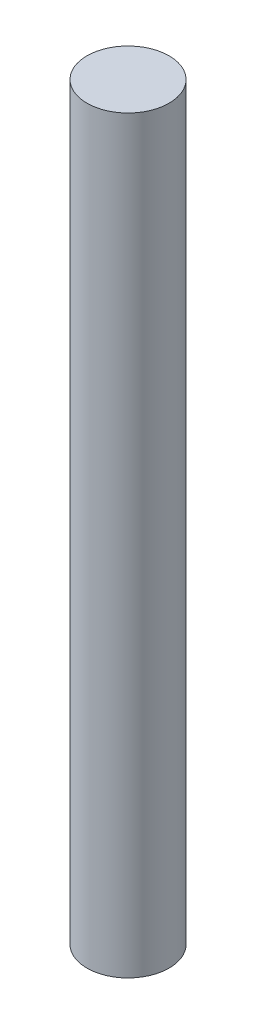
ISO-10303-21;
HEADER;
FILE_DESCRIPTION(('STEP AP214'),'2;1');
FILE_NAME('part.step','',(''),(''),'','','');
FILE_SCHEMA(('AUTOMOTIVE_DESIGN { 1 0 10303 214 1 1 1 1 }'));
ENDSEC;
DATA;
#1=APPLICATION_CONTEXT('core data for automotive mechanical design processes');
#2=APPLICATION_PROTOCOL_DEFINITION('international standard','automotive_design',2000,#1);
#3=PRODUCT_CONTEXT('',#1,'mechanical');
#4=PRODUCT('Part','Part','',(#3));
#5=PRODUCT_RELATED_PRODUCT_CATEGORY('part','',(#4));
#6=PRODUCT_DEFINITION_FORMATION('','',#4);
#7=PRODUCT_DEFINITION_CONTEXT('part definition',#1,'design');
#8=PRODUCT_DEFINITION('design','',#6,#7);
#9=PRODUCT_DEFINITION_SHAPE('','',#8);
#10=(LENGTH_UNIT() NAMED_UNIT(*) SI_UNIT(.MILLI.,.METRE.));
#11=(NAMED_UNIT(*) PLANE_ANGLE_UNIT() SI_UNIT($,.RADIAN.));
#12=(NAMED_UNIT(*) SI_UNIT($,.STERADIAN.) SOLID_ANGLE_UNIT());
#13=UNCERTAINTY_MEASURE_WITH_UNIT(LENGTH_MEASURE(1.E-05),#10,'distance_accuracy_value','');
#14=(GEOMETRIC_REPRESENTATION_CONTEXT(3) GLOBAL_UNCERTAINTY_ASSIGNED_CONTEXT((#13)) GLOBAL_UNIT_ASSIGNED_CONTEXT((#10,
#11,#12)) REPRESENTATION_CONTEXT('',''));
#15=CARTESIAN_POINT('',(0.,0.,0.));
#16=DIRECTION('',(0.,0.,1.));
#17=DIRECTION('',(1.,0.,0.));
#18=AXIS2_PLACEMENT_3D('',#15,#16,#17);
#19=CARTESIAN_POINT('',(0.,29.,0.));
#20=DIRECTION('',(0.,-1.,0.));
#21=DIRECTION('',(0.,0.,-1.));
#22=AXIS2_PLACEMENT_3D('',#19,#20,#21);
#23=CYLINDRICAL_SURFACE('',#22,1.59);
#24=CARTESIAN_POINT('',(0.,29.,0.));
#25=DIRECTION('',(0.,1.,0.));
#26=DIRECTION('',(0.,0.,1.));
#27=AXIS2_PLACEMENT_3D('',#24,#25,#26);
#28=CIRCLE('',#27,1.59);
#29=CARTESIAN_POINT('',(0.,29.,-1.59));
#30=VERTEX_POINT('',#29);
#31=EDGE_CURVE('E10',#30,#30,#28,.T.);
#32=CARTESIAN_POINT('',(0.,0.,0.));
#33=DIRECTION('',(0.,1.,0.));
#34=DIRECTION('',(0.,0.,1.));
#35=AXIS2_PLACEMENT_3D('',#32,#33,#34);
#36=CIRCLE('',#35,1.59);
#37=CARTESIAN_POINT('',(0.,0.,-1.59));
#38=VERTEX_POINT('',#37);
#39=EDGE_CURVE('E37',#38,#38,#36,.T.);
#40=CARTESIAN_POINT('',(0.,29.,-1.59));
#41=CARTESIAN_POINT('',(0.,28.6979166666667,-1.59));
#42=CARTESIAN_POINT('',(0.,28.3958333333333,-1.59));
#43=CARTESIAN_POINT('',(0.,27.7916666666667,-1.59));
#44=CARTESIAN_POINT('',(0.,27.4895833333333,-1.59));
#45=CARTESIAN_POINT('',(0.,26.8854166666667,-1.59));
#46=CARTESIAN_POINT('',(0.,26.5833333333333,-1.59));
#47=CARTESIAN_POINT('',(0.,25.9791666666667,-1.59));
#48=CARTESIAN_POINT('',(0.,25.6770833333333,-1.59));
#49=CARTESIAN_POINT('',(0.,25.0729166666667,-1.59));
#50=CARTESIAN_POINT('',(0.,24.7708333333333,-1.59));
#51=CARTESIAN_POINT('',(0.,24.1666666666667,-1.59));
#52=CARTESIAN_POINT('',(0.,23.8645833333333,-1.59));
#53=CARTESIAN_POINT('',(0.,23.2604166666667,-1.59));
#54=CARTESIAN_POINT('',(0.,22.9583333333333,-1.59));
#55=CARTESIAN_POINT('',(0.,22.3541666666667,-1.59));
#56=CARTESIAN_POINT('',(0.,22.0520833333333,-1.59));
#57=CARTESIAN_POINT('',(0.,21.4479166666667,-1.59));
#58=CARTESIAN_POINT('',(0.,21.1458333333333,-1.59));
#59=CARTESIAN_POINT('',(0.,20.5416666666667,-1.59));
#60=CARTESIAN_POINT('',(0.,20.2395833333333,-1.59));
#61=CARTESIAN_POINT('',(0.,19.6354166666667,-1.59));
#62=CARTESIAN_POINT('',(0.,19.3333333333333,-1.59));
#63=CARTESIAN_POINT('',(0.,18.7291666666667,-1.59));
#64=CARTESIAN_POINT('',(0.,18.4270833333333,-1.59));
#65=CARTESIAN_POINT('',(0.,17.8229166666667,-1.59));
#66=CARTESIAN_POINT('',(0.,17.5208333333333,-1.59));
#67=CARTESIAN_POINT('',(0.,16.9166666666667,-1.59));
#68=CARTESIAN_POINT('',(0.,16.6145833333333,-1.59));
#69=CARTESIAN_POINT('',(0.,16.0104166666667,-1.59));
#70=CARTESIAN_POINT('',(0.,15.7083333333333,-1.59));
#71=CARTESIAN_POINT('',(0.,15.1041666666667,-1.59));
#72=CARTESIAN_POINT('',(0.,14.8020833333333,-1.59));
#73=CARTESIAN_POINT('',(0.,14.1979166666667,-1.59));
#74=CARTESIAN_POINT('',(0.,13.8958333333333,-1.59));
#75=CARTESIAN_POINT('',(0.,13.2916666666667,-1.59));
#76=CARTESIAN_POINT('',(0.,12.9895833333333,-1.59));
#77=CARTESIAN_POINT('',(0.,12.3854166666667,-1.59));
#78=CARTESIAN_POINT('',(0.,12.0833333333333,-1.59));
#79=CARTESIAN_POINT('',(0.,11.4791666666667,-1.59));
#80=CARTESIAN_POINT('',(0.,11.1770833333333,-1.59));
#81=CARTESIAN_POINT('',(0.,10.5729166666667,-1.59));
#82=CARTESIAN_POINT('',(0.,10.2708333333333,-1.59));
#83=CARTESIAN_POINT('',(0.,9.66666666666667,-1.59));
#84=CARTESIAN_POINT('',(0.,9.36458333333333,-1.59));
#85=CARTESIAN_POINT('',(0.,8.76041666666667,-1.59));
#86=CARTESIAN_POINT('',(0.,8.45833333333333,-1.59));
#87=CARTESIAN_POINT('',(0.,7.85416666666667,-1.59));
#88=CARTESIAN_POINT('',(0.,7.55208333333333,-1.59));
#89=CARTESIAN_POINT('',(0.,6.94791666666667,-1.59));
#90=CARTESIAN_POINT('',(0.,6.64583333333333,-1.59));
#91=CARTESIAN_POINT('',(0.,6.04166666666667,-1.59));
#92=CARTESIAN_POINT('',(0.,5.73958333333333,-1.59));
#93=CARTESIAN_POINT('',(0.,5.13541666666667,-1.59));
#94=CARTESIAN_POINT('',(0.,4.83333333333333,-1.59));
#95=CARTESIAN_POINT('',(0.,4.22916666666667,-1.59));
#96=CARTESIAN_POINT('',(0.,3.92708333333333,-1.59));
#97=CARTESIAN_POINT('',(0.,3.32291666666667,-1.59));
#98=CARTESIAN_POINT('',(0.,3.02083333333333,-1.59));
#99=CARTESIAN_POINT('',(0.,2.41666666666667,-1.59));
#100=CARTESIAN_POINT('',(0.,2.11458333333333,-1.59));
#101=CARTESIAN_POINT('',(0.,1.51041666666667,-1.59));
#102=CARTESIAN_POINT('',(0.,1.20833333333333,-1.59));
#103=CARTESIAN_POINT('',(0.,0.604166666666667,-1.59));
#104=CARTESIAN_POINT('',(0.,0.302083333333333,-1.59));
#105=CARTESIAN_POINT('',(0.,0.,-1.59));
#106=B_SPLINE_CURVE_WITH_KNOTS('',3,(#40,#41,#42,#43,#44,#45,#46,#47,#48,#49,#50,#51,#52,#53,
#54,#55,#56,#57,#58,#59,#60,#61,#62,#63,#64,#65,#66,#67,#68,#69,#70,#71,#72,#73,#74,#75,#76,#77,
#78,#79,#80,#81,#82,#83,#84,#85,#86,#87,#88,#89,#90,#91,#92,#93,#94,#95,#96,#97,#98,#99,#100,
#101,#102,#103,#104,#105),.UNSPECIFIED.,.F.,.F.,(4,2,2,2,2,2,2,2,2,2,2,2,2,2,2,2,2,2,2,2,2,2,2,
2,2,2,2,2,2,2,2,2,4),(0.,0.906249999999997,1.8125,2.71875,3.625,4.53125,5.4375,6.34375,7.25,
8.15625,9.0625,9.96875,10.875,11.78125,12.6875,13.59375,14.5,15.40625,16.3125,17.21875,18.125,
19.03125,19.9375,20.84375,21.75,22.65625,23.5625,24.46875,25.375,26.28125,27.1875,28.09375,29.),.UNSPECIFIED.);
#107=EDGE_CURVE('BSEAM34',#30,#38,#106,.T.);
#108=ORIENTED_EDGE('',*,*,#31,.F.);
#109=ORIENTED_EDGE('',*,*,#39,.T.);
#110=ORIENTED_EDGE('',*,*,#107,.T.);
#111=ORIENTED_EDGE('',*,*,#107,.F.);
#112=EDGE_LOOP('',(#108,#110,#109,#111));
#113=FACE_BOUND('',#112,.T.);
#114=ADVANCED_FACE('F34',(#113),#23,.T.);
#115=CARTESIAN_POINT('',(0.,29.,0.));
#116=DIRECTION('',(0.,1.,0.));
#117=DIRECTION('',(0.,0.,1.));
#118=AXIS2_PLACEMENT_3D('',#115,#116,#117);
#119=PLANE('',#118);
#120=ORIENTED_EDGE('',*,*,#31,.T.);
#121=EDGE_LOOP('',(#120));
#122=FACE_BOUND('',#121,.T.);
#123=ADVANCED_FACE('F49',(#122),#119,.T.);
#124=CARTESIAN_POINT('',(0.,0.,0.));
#125=DIRECTION('',(0.,1.,0.));
#126=DIRECTION('',(0.,0.,1.));
#127=AXIS2_PLACEMENT_3D('',#124,#125,#126);
#128=PLANE('',#127);
#129=ORIENTED_EDGE('',*,*,#39,.F.);
#130=EDGE_LOOP('',(#129));
#131=FACE_BOUND('',#130,.T.);
#132=ADVANCED_FACE('F47',(#131),#128,.F.);
#133=CLOSED_SHELL('',(#114,#123,#132));
#134=MANIFOLD_SOLID_BREP('B2',#133);
#135=ADVANCED_BREP_SHAPE_REPRESENTATION('',(#18,#134),#14);
#136=SHAPE_DEFINITION_REPRESENTATION(#9,#135);
ENDSEC;
END-ISO-10303-21;
